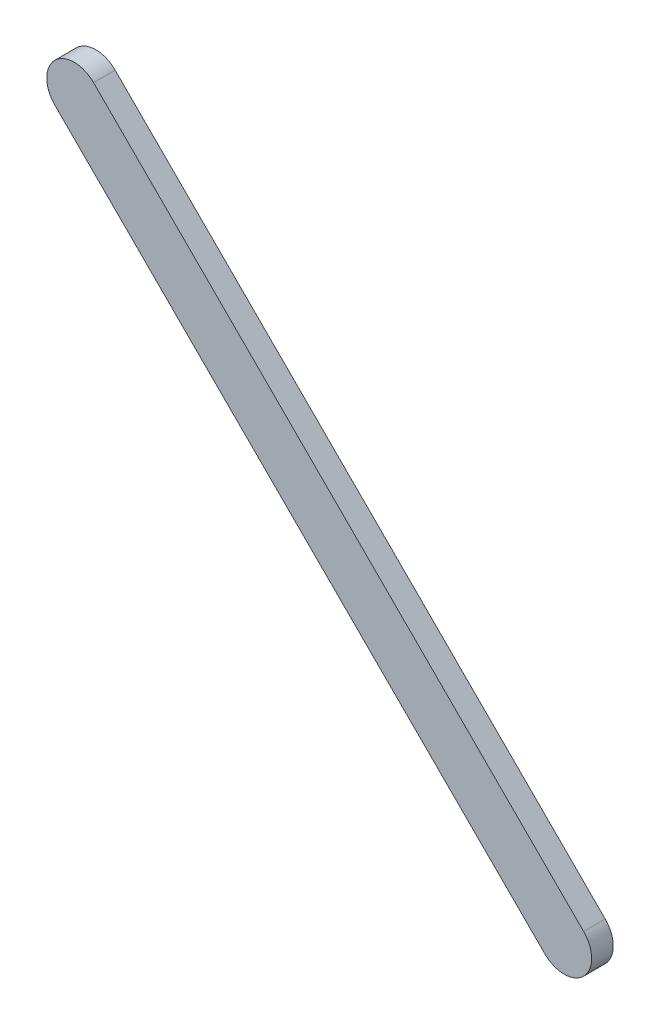
ISO-10303-21;
HEADER;
FILE_DESCRIPTION(('STEP AP214'),'2;1');
FILE_NAME('part.step','',(''),(''),'','','');
FILE_SCHEMA(('AUTOMOTIVE_DESIGN { 1 0 10303 214 1 1 1 1 }'));
ENDSEC;
DATA;
#1=APPLICATION_CONTEXT('core data for automotive mechanical design processes');
#2=APPLICATION_PROTOCOL_DEFINITION('international standard','automotive_design',2000,#1);
#3=PRODUCT_CONTEXT('',#1,'mechanical');
#4=PRODUCT('Part','Part','',(#3));
#5=PRODUCT_RELATED_PRODUCT_CATEGORY('part','',(#4));
#6=PRODUCT_DEFINITION_FORMATION('','',#4);
#7=PRODUCT_DEFINITION_CONTEXT('part definition',#1,'design');
#8=PRODUCT_DEFINITION('design','',#6,#7);
#9=PRODUCT_DEFINITION_SHAPE('','',#8);
#10=(LENGTH_UNIT() NAMED_UNIT(*) SI_UNIT(.MILLI.,.METRE.));
#11=(NAMED_UNIT(*) PLANE_ANGLE_UNIT() SI_UNIT($,.RADIAN.));
#12=(NAMED_UNIT(*) SI_UNIT($,.STERADIAN.) SOLID_ANGLE_UNIT());
#13=UNCERTAINTY_MEASURE_WITH_UNIT(LENGTH_MEASURE(1.E-05),#10,'distance_accuracy_value','');
#14=(GEOMETRIC_REPRESENTATION_CONTEXT(3) GLOBAL_UNCERTAINTY_ASSIGNED_CONTEXT((#13)) GLOBAL_UNIT_ASSIGNED_CONTEXT((#10,
#11,#12)) REPRESENTATION_CONTEXT('',''));
#15=CARTESIAN_POINT('',(0.,0.,0.));
#16=DIRECTION('',(0.,0.,1.));
#17=DIRECTION('',(1.,0.,0.));
#18=AXIS2_PLACEMENT_3D('',#15,#16,#17);
#19=CARTESIAN_POINT('',(115.8800578,119.26953286,0.));
#20=DIRECTION('',(0.707106781186548,0.707106781186548,0.));
#21=DIRECTION('',(0.707106781186548,-0.707106781186548,0.));
#22=AXIS2_PLACEMENT_3D('',#19,#20,#21);
#23=PLANE('',#22);
#24=DIRECTION('',(0.707106781186548,-0.707106781186548,0.));
#25=VECTOR('',#24,1.);
#26=CARTESIAN_POINT('',(115.8800578,119.26953286,0.1999996));
#27=LINE('',#26,#25);
#28=CARTESIAN_POINT('',(115.8800578,119.26953286,0.1999996));
#29=VERTEX_POINT('',#28);
#30=CARTESIAN_POINT('',(120.41959406,114.7299966,0.1999996));
#31=VERTEX_POINT('',#30);
#32=EDGE_CURVE('E11',#29,#31,#27,.T.);
#33=ORIENTED_EDGE('',*,*,#32,.F.);
#34=DIRECTION('',(0.,0.,1.));
#35=VECTOR('',#34,1.);
#36=CARTESIAN_POINT('',(115.8800578,119.26953286,0.));
#37=LINE('',#36,#35);
#38=CARTESIAN_POINT('',(115.8800578,119.26953286,0.));
#39=VERTEX_POINT('',#38);
#40=EDGE_CURVE('E24',#39,#29,#37,.T.);
#41=ORIENTED_EDGE('',*,*,#40,.F.);
#42=DIRECTION('',(0.707106781186548,-0.707106781186548,0.));
#43=VECTOR('',#42,1.);
#44=CARTESIAN_POINT('',(115.8800578,119.26953286,0.));
#45=LINE('',#44,#43);
#46=CARTESIAN_POINT('',(120.41959406,114.7299966,0.));
#47=VERTEX_POINT('',#46);
#48=EDGE_CURVE('E75',#39,#47,#45,.T.);
#49=ORIENTED_EDGE('',*,*,#48,.T.);
#50=DIRECTION('',(0.,0.,1.));
#51=VECTOR('',#50,1.);
#52=CARTESIAN_POINT('',(120.41959406,114.7299966,0.));
#53=LINE('',#52,#51);
#54=EDGE_CURVE('E37',#47,#31,#53,.T.);
#55=ORIENTED_EDGE('',*,*,#54,.T.);
#56=EDGE_LOOP('',(#33,#41,#49,#55));
#57=FACE_BOUND('',#56,.T.);
#58=ADVANCED_FACE('F17',(#57),#23,.F.);
#59=CARTESIAN_POINT('',(120.59919873,114.90960127,0.));
#60=DIRECTION('',(0.,0.,-1.));
#61=DIRECTION('',(-0.707106781186576,-0.70710678118652,0.));
#62=AXIS2_PLACEMENT_3D('',#59,#60,#61);
#63=CYLINDRICAL_SURFACE('',#62,0.253999360179546);
#64=CARTESIAN_POINT('',(120.59919873,114.90960127,0.1999996));
#65=DIRECTION('',(0.,0.,1.));
#66=DIRECTION('',(-0.707106781186576,-0.70710678118652,0.));
#67=AXIS2_PLACEMENT_3D('',#64,#65,#66);
#68=CIRCLE('',#67,0.253999360179546);
#69=CARTESIAN_POINT('',(120.7788034,115.08920594,0.1999996));
#70=VERTEX_POINT('',#69);
#71=EDGE_CURVE('E83',#31,#70,#68,.T.);
#72=ORIENTED_EDGE('',*,*,#71,.F.);
#73=ORIENTED_EDGE('',*,*,#54,.F.);
#74=CARTESIAN_POINT('',(120.59919873,114.90960127,0.));
#75=DIRECTION('',(0.,0.,1.));
#76=DIRECTION('',(-0.707106781186576,-0.70710678118652,0.));
#77=AXIS2_PLACEMENT_3D('',#74,#75,#76);
#78=CIRCLE('',#77,0.253999360179546);
#79=CARTESIAN_POINT('',(120.7788034,115.08920594,0.));
#80=VERTEX_POINT('',#79);
#81=EDGE_CURVE('E81',#47,#80,#78,.T.);
#82=ORIENTED_EDGE('',*,*,#81,.T.);
#83=DIRECTION('',(0.,0.,1.));
#84=VECTOR('',#83,1.);
#85=CARTESIAN_POINT('',(120.7788034,115.08920594,0.));
#86=LINE('',#85,#84);
#87=EDGE_CURVE('E67',#80,#70,#86,.T.);
#88=ORIENTED_EDGE('',*,*,#87,.T.);
#89=EDGE_LOOP('',(#72,#73,#82,#88));
#90=FACE_BOUND('',#89,.T.);
#91=ADVANCED_FACE('F89',(#90),#63,.T.);
#92=CARTESIAN_POINT('',(120.7788034,115.08920594,0.));
#93=DIRECTION('',(-0.707106781186548,-0.707106781186548,0.));
#94=DIRECTION('',(-0.707106781186548,0.707106781186548,0.));
#95=AXIS2_PLACEMENT_3D('',#92,#93,#94);
#96=PLANE('',#95);
#97=DIRECTION('',(-0.707106781186548,0.707106781186548,0.));
#98=VECTOR('',#97,1.);
#99=CARTESIAN_POINT('',(120.7788034,115.08920594,0.1999996));
#100=LINE('',#99,#98);
#101=CARTESIAN_POINT('',(116.23926714,119.6287422,0.1999996));
#102=VERTEX_POINT('',#101);
#103=EDGE_CURVE('E71',#70,#102,#100,.T.);
#104=ORIENTED_EDGE('',*,*,#103,.F.);
#105=ORIENTED_EDGE('',*,*,#87,.F.);
#106=DIRECTION('',(-0.707106781186548,0.707106781186548,0.));
#107=VECTOR('',#106,1.);
#108=CARTESIAN_POINT('',(120.7788034,115.08920594,0.));
#109=LINE('',#108,#107);
#110=CARTESIAN_POINT('',(116.23926714,119.6287422,0.));
#111=VERTEX_POINT('',#110);
#112=EDGE_CURVE('E63',#80,#111,#109,.T.);
#113=ORIENTED_EDGE('',*,*,#112,.T.);
#114=DIRECTION('',(0.,0.,1.));
#115=VECTOR('',#114,1.);
#116=CARTESIAN_POINT('',(116.23926714,119.6287422,0.));
#117=LINE('',#116,#115);
#118=EDGE_CURVE('E53',#111,#102,#117,.T.);
#119=ORIENTED_EDGE('',*,*,#118,.T.);
#120=EDGE_LOOP('',(#104,#105,#113,#119));
#121=FACE_BOUND('',#120,.T.);
#122=ADVANCED_FACE('F66',(#121),#96,.F.);
#123=CARTESIAN_POINT('',(116.05966247,119.44913753,0.));
#124=DIRECTION('',(0.,0.,-1.));
#125=DIRECTION('',(0.70710678118652,0.707106781186576,0.));
#126=AXIS2_PLACEMENT_3D('',#123,#124,#125);
#127=CYLINDRICAL_SURFACE('',#126,0.253999360179542);
#128=CARTESIAN_POINT('',(116.05966247,119.44913753,0.1999996));
#129=DIRECTION('',(0.,0.,1.));
#130=DIRECTION('',(0.70710678118652,0.707106781186576,0.));
#131=AXIS2_PLACEMENT_3D('',#128,#129,#130);
#132=CIRCLE('',#131,0.253999360179542);
#133=EDGE_CURVE('E59',#102,#29,#132,.T.);
#134=ORIENTED_EDGE('',*,*,#133,.F.);
#135=ORIENTED_EDGE('',*,*,#118,.F.);
#136=CARTESIAN_POINT('',(116.05966247,119.44913753,0.));
#137=DIRECTION('',(0.,0.,1.));
#138=DIRECTION('',(0.70710678118652,0.707106781186576,0.));
#139=AXIS2_PLACEMENT_3D('',#136,#137,#138);
#140=CIRCLE('',#139,0.253999360179542);
#141=EDGE_CURVE('E57',#111,#39,#140,.T.);
#142=ORIENTED_EDGE('',*,*,#141,.T.);
#143=ORIENTED_EDGE('',*,*,#40,.T.);
#144=EDGE_LOOP('',(#134,#135,#142,#143));
#145=FACE_BOUND('',#144,.T.);
#146=ADVANCED_FACE('F55',(#145),#127,.T.);
#147=CARTESIAN_POINT('',(115.8800578,119.26953286,0.));
#148=DIRECTION('',(0.,0.,-1.));
#149=DIRECTION('',(-1.,0.,0.));
#150=AXIS2_PLACEMENT_3D('',#147,#148,#149);
#151=PLANE('',#150);
#152=ORIENTED_EDGE('',*,*,#141,.F.);
#153=ORIENTED_EDGE('',*,*,#112,.F.);
#154=ORIENTED_EDGE('',*,*,#81,.F.);
#155=ORIENTED_EDGE('',*,*,#48,.F.);
#156=EDGE_LOOP('',(#152,#153,#154,#155));
#157=FACE_BOUND('',#156,.T.);
#158=ADVANCED_FACE('F74',(#157),#151,.T.);
#159=CARTESIAN_POINT('',(115.8800578,119.26953286,0.1999996));
#160=DIRECTION('',(0.,0.,-1.));
#161=DIRECTION('',(-1.,0.,0.));
#162=AXIS2_PLACEMENT_3D('',#159,#160,#161);
#163=PLANE('',#162);
#164=ORIENTED_EDGE('',*,*,#32,.T.);
#165=ORIENTED_EDGE('',*,*,#71,.T.);
#166=ORIENTED_EDGE('',*,*,#103,.T.);
#167=ORIENTED_EDGE('',*,*,#133,.T.);
#168=EDGE_LOOP('',(#164,#165,#166,#167));
#169=FACE_BOUND('',#168,.T.);
#170=ADVANCED_FACE('F91',(#169),#163,.F.);
#171=CLOSED_SHELL('',(#58,#91,#122,#146,#158,#170));
#172=MANIFOLD_SOLID_BREP('B1',#171);
#173=ADVANCED_BREP_SHAPE_REPRESENTATION('',(#18,#172),#14);
#174=SHAPE_DEFINITION_REPRESENTATION(#9,#173);
ENDSEC;
END-ISO-10303-21;
